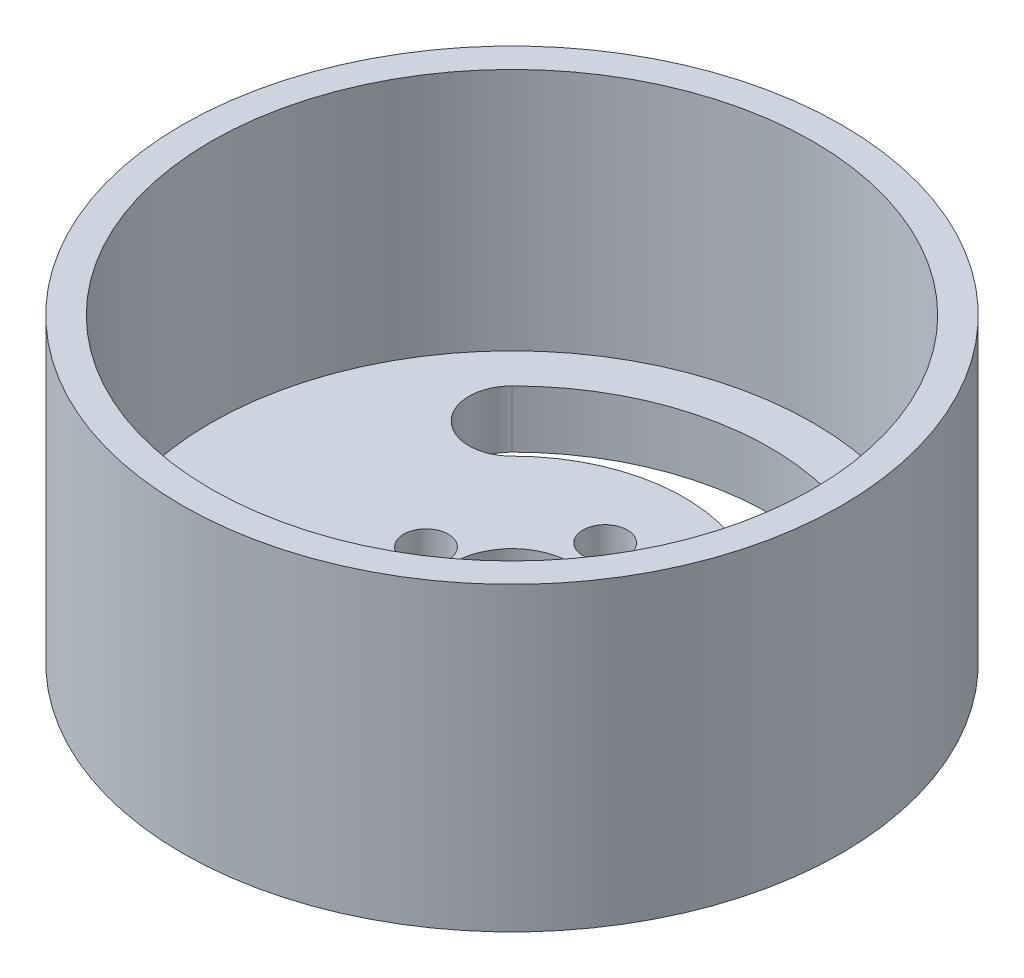
ISO-10303-21;
HEADER;
FILE_DESCRIPTION(('STEP AP214'),'2;1');
FILE_NAME('part.step','',(''),(''),'','','');
FILE_SCHEMA(('AUTOMOTIVE_DESIGN { 1 0 10303 214 1 1 1 1 }'));
ENDSEC;
DATA;
#1=APPLICATION_CONTEXT('core data for automotive mechanical design processes');
#2=APPLICATION_PROTOCOL_DEFINITION('international standard','automotive_design',2000,#1);
#3=PRODUCT_CONTEXT('',#1,'mechanical');
#4=PRODUCT('Part','Part','',(#3));
#5=PRODUCT_RELATED_PRODUCT_CATEGORY('part','',(#4));
#6=PRODUCT_DEFINITION_FORMATION('','',#4);
#7=PRODUCT_DEFINITION_CONTEXT('part definition',#1,'design');
#8=PRODUCT_DEFINITION('design','',#6,#7);
#9=PRODUCT_DEFINITION_SHAPE('','',#8);
#10=(LENGTH_UNIT() NAMED_UNIT(*) SI_UNIT(.MILLI.,.METRE.));
#11=(NAMED_UNIT(*) PLANE_ANGLE_UNIT() SI_UNIT($,.RADIAN.));
#12=(NAMED_UNIT(*) SI_UNIT($,.STERADIAN.) SOLID_ANGLE_UNIT());
#13=UNCERTAINTY_MEASURE_WITH_UNIT(LENGTH_MEASURE(1.E-05),#10,'distance_accuracy_value','');
#14=(GEOMETRIC_REPRESENTATION_CONTEXT(3) GLOBAL_UNCERTAINTY_ASSIGNED_CONTEXT((#13)) GLOBAL_UNIT_ASSIGNED_CONTEXT((#10,
#11,#12)) REPRESENTATION_CONTEXT('',''));
#15=CARTESIAN_POINT('',(0.,0.,0.));
#16=DIRECTION('',(0.,0.,1.));
#17=DIRECTION('',(1.,0.,0.));
#18=AXIS2_PLACEMENT_3D('',#15,#16,#17);
#19=CARTESIAN_POINT('',(0.,4.,0.));
#20=DIRECTION('',(0.,1.,0.));
#21=DIRECTION('',(0.,0.,1.));
#22=AXIS2_PLACEMENT_3D('',#19,#20,#21);
#23=PLANE('',#22);
#24=CARTESIAN_POINT('',(0.,4.,0.));
#25=DIRECTION('',(0.,-1.,0.));
#26=DIRECTION('',(0.,0.,-1.));
#27=AXIS2_PLACEMENT_3D('',#24,#25,#26);
#28=CIRCLE('',#27,21.);
#29=CARTESIAN_POINT('',(0.,4.,-21.));
#30=VERTEX_POINT('',#29);
#31=EDGE_CURVE('E19',#30,#30,#28,.F.);
#32=ORIENTED_EDGE('',*,*,#31,.T.);
#33=EDGE_LOOP('',(#32));
#34=FACE_BOUND('',#33,.T.);
#35=CARTESIAN_POINT('',(0.,4.,6.5));
#36=DIRECTION('',(0.,-1.,0.));
#37=DIRECTION('',(0.,0.,-1.));
#38=AXIS2_PLACEMENT_3D('',#35,#36,#37);
#39=CIRCLE('',#38,1.55);
#40=CARTESIAN_POINT('',(0.,4.,4.95));
#41=VERTEX_POINT('',#40);
#42=EDGE_CURVE('E166',#41,#41,#39,.T.);
#43=ORIENTED_EDGE('',*,*,#42,.T.);
#44=EDGE_LOOP('',(#43));
#45=FACE_BOUND('',#44,.T.);
#46=CARTESIAN_POINT('',(6.,4.,0.));
#47=DIRECTION('',(0.,-1.,0.));
#48=DIRECTION('',(0.,0.,-1.));
#49=AXIS2_PLACEMENT_3D('',#46,#47,#48);
#50=CIRCLE('',#49,1.55);
#51=CARTESIAN_POINT('',(6.,4.,-1.55));
#52=VERTEX_POINT('',#51);
#53=EDGE_CURVE('E172',#52,#52,#50,.T.);
#54=ORIENTED_EDGE('',*,*,#53,.T.);
#55=EDGE_LOOP('',(#54));
#56=FACE_BOUND('',#55,.T.);
#57=CARTESIAN_POINT('',(0.,4.,-6.5));
#58=DIRECTION('',(0.,-1.,0.));
#59=DIRECTION('',(0.,0.,-1.));
#60=AXIS2_PLACEMENT_3D('',#57,#58,#59);
#61=CIRCLE('',#60,1.55);
#62=CARTESIAN_POINT('',(0.,4.,-8.05));
#63=VERTEX_POINT('',#62);
#64=EDGE_CURVE('E97',#63,#63,#61,.T.);
#65=ORIENTED_EDGE('',*,*,#64,.T.);
#66=EDGE_LOOP('',(#65));
#67=FACE_BOUND('',#66,.T.);
#68=CARTESIAN_POINT('',(-6.,4.,0.));
#69=DIRECTION('',(0.,-1.,0.));
#70=DIRECTION('',(0.,0.,-1.));
#71=AXIS2_PLACEMENT_3D('',#68,#69,#70);
#72=CIRCLE('',#71,1.55);
#73=CARTESIAN_POINT('',(-6.,4.,-1.55));
#74=VERTEX_POINT('',#73);
#75=EDGE_CURVE('E169',#74,#74,#72,.T.);
#76=ORIENTED_EDGE('',*,*,#75,.T.);
#77=EDGE_LOOP('',(#76));
#78=FACE_BOUND('',#77,.T.);
#79=CARTESIAN_POINT('',(0.,4.,0.));
#80=DIRECTION('',(0.,-1.,0.));
#81=DIRECTION('',(0.,0.,-1.));
#82=AXIS2_PLACEMENT_3D('',#79,#80,#81);
#83=CIRCLE('',#82,4.1);
#84=CARTESIAN_POINT('',(0.,4.,-4.1));
#85=VERTEX_POINT('',#84);
#86=EDGE_CURVE('E163',#85,#85,#83,.T.);
#87=ORIENTED_EDGE('',*,*,#86,.T.);
#88=EDGE_LOOP('',(#87));
#89=FACE_BOUND('',#88,.T.);
#90=CARTESIAN_POINT('',(0.,4.,0.));
#91=DIRECTION('',(0.,-1.,0.));
#92=DIRECTION('',(0.,0.,-1.));
#93=AXIS2_PLACEMENT_3D('',#90,#91,#92);
#94=CIRCLE('',#93,18.);
#95=CARTESIAN_POINT('',(12.7279220613577,4.,12.727922061358));
#96=VERTEX_POINT('',#95);
#97=CARTESIAN_POINT('',(-12.7279220613577,4.,12.727922061358));
#98=VERTEX_POINT('',#97);
#99=EDGE_CURVE('E79',#96,#98,#94,.T.);
#100=ORIENTED_EDGE('',*,*,#99,.T.);
#101=CARTESIAN_POINT('',(-10.6066017177981,4.,10.6066017177983));
#102=DIRECTION('',(0.,-1.,0.));
#103=DIRECTION('',(0.,0.,-1.));
#104=AXIS2_PLACEMENT_3D('',#101,#102,#103);
#105=CIRCLE('',#104,3.);
#106=CARTESIAN_POINT('',(-8.48528137423846,4.,8.48528137423868));
#107=VERTEX_POINT('',#106);
#108=EDGE_CURVE('E112',#98,#107,#105,.T.);
#109=ORIENTED_EDGE('',*,*,#108,.T.);
#110=CARTESIAN_POINT('',(0.,4.,0.));
#111=DIRECTION('',(0.,-1.,0.));
#112=DIRECTION('',(0.,0.,-1.));
#113=AXIS2_PLACEMENT_3D('',#110,#111,#112);
#114=CIRCLE('',#113,12.);
#115=CARTESIAN_POINT('',(8.48528137423847,4.,8.48528137423867));
#116=VERTEX_POINT('',#115);
#117=EDGE_CURVE('E93',#116,#107,#114,.T.);
#118=ORIENTED_EDGE('',*,*,#117,.F.);
#119=CARTESIAN_POINT('',(10.6066017177981,4.,10.6066017177983));
#120=DIRECTION('',(0.,-1.,0.));
#121=DIRECTION('',(0.,0.,-1.));
#122=AXIS2_PLACEMENT_3D('',#119,#120,#121);
#123=CIRCLE('',#122,3.);
#124=EDGE_CURVE('E90',#116,#96,#123,.T.);
#125=ORIENTED_EDGE('',*,*,#124,.T.);
#126=EDGE_LOOP('',(#100,#109,#118,#125));
#127=FACE_BOUND('',#126,.T.);
#128=CARTESIAN_POINT('',(-10.6066017177981,4.,-10.6066017177983));
#129=DIRECTION('',(0.,-1.,0.));
#130=DIRECTION('',(0.,0.,-1.));
#131=AXIS2_PLACEMENT_3D('',#128,#129,#130);
#132=CIRCLE('',#131,3.);
#133=CARTESIAN_POINT('',(-8.48528137423846,4.,-8.48528137423867));
#134=VERTEX_POINT('',#133);
#135=CARTESIAN_POINT('',(-12.7279220613577,4.,-12.727922061358));
#136=VERTEX_POINT('',#135);
#137=EDGE_CURVE('E160',#134,#136,#132,.T.);
#138=ORIENTED_EDGE('',*,*,#137,.T.);
#139=CARTESIAN_POINT('',(0.,4.,0.));
#140=DIRECTION('',(0.,-1.,0.));
#141=DIRECTION('',(0.,0.,-1.));
#142=AXIS2_PLACEMENT_3D('',#139,#140,#141);
#143=CIRCLE('',#142,18.);
#144=CARTESIAN_POINT('',(12.7279220613577,4.,-12.727922061358));
#145=VERTEX_POINT('',#144);
#146=EDGE_CURVE('E158',#136,#145,#143,.T.);
#147=ORIENTED_EDGE('',*,*,#146,.T.);
#148=CARTESIAN_POINT('',(10.6066017177981,4.,-10.6066017177983));
#149=DIRECTION('',(0.,-1.,0.));
#150=DIRECTION('',(0.,0.,-1.));
#151=AXIS2_PLACEMENT_3D('',#148,#149,#150);
#152=CIRCLE('',#151,3.);
#153=CARTESIAN_POINT('',(8.48528137423846,4.,-8.48528137423867));
#154=VERTEX_POINT('',#153);
#155=EDGE_CURVE('E154',#145,#154,#152,.T.);
#156=ORIENTED_EDGE('',*,*,#155,.T.);
#157=CARTESIAN_POINT('',(0.,4.,0.));
#158=DIRECTION('',(0.,-1.,0.));
#159=DIRECTION('',(0.,0.,-1.));
#160=AXIS2_PLACEMENT_3D('',#157,#158,#159);
#161=CIRCLE('',#160,12.);
#162=EDGE_CURVE('E151',#134,#154,#161,.T.);
#163=ORIENTED_EDGE('',*,*,#162,.F.);
#164=EDGE_LOOP('',(#138,#147,#156,#163));
#165=FACE_BOUND('',#164,.T.);
#166=ADVANCED_FACE('F16',(#34,#45,#56,#67,#78,#89,#127,#165),#23,.T.);
#167=CARTESIAN_POINT('',(0.,21.,0.));
#168=DIRECTION('',(0.,-1.,0.));
#169=DIRECTION('',(0.,0.,-1.));
#170=AXIS2_PLACEMENT_3D('',#167,#168,#169);
#171=CYLINDRICAL_SURFACE('',#170,21.);
#172=CARTESIAN_POINT('',(0.,21.,0.));
#173=DIRECTION('',(0.,-1.,0.));
#174=DIRECTION('',(0.,0.,-1.));
#175=AXIS2_PLACEMENT_3D('',#172,#173,#174);
#176=CIRCLE('',#175,21.);
#177=CARTESIAN_POINT('',(0.,21.,-21.));
#178=VERTEX_POINT('',#177);
#179=EDGE_CURVE('E147',#178,#178,#176,.T.);
#180=ORIENTED_EDGE('',*,*,#179,.F.);
#181=EDGE_LOOP('',(#180));
#182=FACE_BOUND('',#181,.T.);
#183=ORIENTED_EDGE('',*,*,#31,.F.);
#184=EDGE_LOOP('',(#183));
#185=FACE_BOUND('',#184,.T.);
#186=ADVANCED_FACE('F245',(#182,#185),#171,.F.);
#187=CARTESIAN_POINT('',(0.,2.,0.));
#188=DIRECTION('',(0.,-1.,0.));
#189=DIRECTION('',(0.,0.,-1.));
#190=AXIS2_PLACEMENT_3D('',#187,#188,#189);
#191=CYLINDRICAL_SURFACE('',#190,18.);
#192=DIRECTION('',(0.,-1.,0.));
#193=VECTOR('',#192,1.);
#194=CARTESIAN_POINT('',(-12.7279220613577,2.,12.727922061358));
#195=LINE('',#194,#193);
#196=CARTESIAN_POINT('',(-12.7279220613577,0.,12.727922061358));
#197=VERTEX_POINT('',#196);
#198=EDGE_CURVE('E87',#197,#98,#195,.F.);
#199=ORIENTED_EDGE('',*,*,#198,.T.);
#200=ORIENTED_EDGE('',*,*,#99,.F.);
#201=DIRECTION('',(0.,-1.,0.));
#202=VECTOR('',#201,1.);
#203=CARTESIAN_POINT('',(12.7279220613577,2.,12.727922061358));
#204=LINE('',#203,#202);
#205=CARTESIAN_POINT('',(12.7279220613577,0.,12.727922061358));
#206=VERTEX_POINT('',#205);
#207=EDGE_CURVE('E84',#96,#206,#204,.T.);
#208=ORIENTED_EDGE('',*,*,#207,.T.);
#209=CARTESIAN_POINT('',(0.,0.,0.));
#210=DIRECTION('',(0.,-1.,0.));
#211=DIRECTION('',(0.,0.,-1.));
#212=AXIS2_PLACEMENT_3D('',#209,#210,#211);
#213=CIRCLE('',#212,18.);
#214=EDGE_CURVE('E145',#206,#197,#213,.T.);
#215=ORIENTED_EDGE('',*,*,#214,.T.);
#216=EDGE_LOOP('',(#199,#200,#208,#215));
#217=FACE_BOUND('',#216,.T.);
#218=ADVANCED_FACE('F81',(#217),#191,.F.);
#219=CARTESIAN_POINT('',(-10.6066017177981,2.,10.6066017177983));
#220=DIRECTION('',(0.,-1.,0.));
#221=DIRECTION('',(0.,0.,-1.));
#222=AXIS2_PLACEMENT_3D('',#219,#220,#221);
#223=CYLINDRICAL_SURFACE('',#222,3.);
#224=ORIENTED_EDGE('',*,*,#108,.F.);
#225=ORIENTED_EDGE('',*,*,#198,.F.);
#226=CARTESIAN_POINT('',(-10.6066017177981,0.,10.6066017177983));
#227=DIRECTION('',(0.,-1.,0.));
#228=DIRECTION('',(0.,0.,-1.));
#229=AXIS2_PLACEMENT_3D('',#226,#227,#228);
#230=CIRCLE('',#229,3.);
#231=CARTESIAN_POINT('',(-8.48528137423846,0.,8.48528137423868));
#232=VERTEX_POINT('',#231);
#233=EDGE_CURVE('E143',#197,#232,#230,.T.);
#234=ORIENTED_EDGE('',*,*,#233,.T.);
#235=DIRECTION('',(0.,-1.,0.));
#236=VECTOR('',#235,1.);
#237=CARTESIAN_POINT('',(-8.48528137423846,2.,8.48528137423868));
#238=LINE('',#237,#236);
#239=EDGE_CURVE('E104',#107,#232,#238,.T.);
#240=ORIENTED_EDGE('',*,*,#239,.F.);
#241=EDGE_LOOP('',(#224,#225,#234,#240));
#242=FACE_BOUND('',#241,.T.);
#243=ADVANCED_FACE('F181',(#242),#223,.F.);
#244=CARTESIAN_POINT('',(0.,2.,0.));
#245=DIRECTION('',(0.,-1.,0.));
#246=DIRECTION('',(0.,0.,-1.));
#247=AXIS2_PLACEMENT_3D('',#244,#245,#246);
#248=CYLINDRICAL_SURFACE('',#247,12.);
#249=ORIENTED_EDGE('',*,*,#117,.T.);
#250=ORIENTED_EDGE('',*,*,#239,.T.);
#251=CARTESIAN_POINT('',(0.,0.,0.));
#252=DIRECTION('',(0.,-1.,0.));
#253=DIRECTION('',(0.,0.,-1.));
#254=AXIS2_PLACEMENT_3D('',#251,#252,#253);
#255=CIRCLE('',#254,12.);
#256=CARTESIAN_POINT('',(8.48528137423847,0.,8.48528137423867));
#257=VERTEX_POINT('',#256);
#258=EDGE_CURVE('E140',#232,#257,#255,.F.);
#259=ORIENTED_EDGE('',*,*,#258,.T.);
#260=DIRECTION('',(0.,-1.,0.));
#261=VECTOR('',#260,1.);
#262=CARTESIAN_POINT('',(8.48528137423847,2.,8.48528137423867));
#263=LINE('',#262,#261);
#264=EDGE_CURVE('E102',#257,#116,#263,.F.);
#265=ORIENTED_EDGE('',*,*,#264,.T.);
#266=EDGE_LOOP('',(#249,#250,#259,#265));
#267=FACE_BOUND('',#266,.T.);
#268=ADVANCED_FACE('F184',(#267),#248,.T.);
#269=CARTESIAN_POINT('',(10.6066017177981,2.,10.6066017177983));
#270=DIRECTION('',(0.,-1.,0.));
#271=DIRECTION('',(0.,0.,-1.));
#272=AXIS2_PLACEMENT_3D('',#269,#270,#271);
#273=CYLINDRICAL_SURFACE('',#272,3.);
#274=ORIENTED_EDGE('',*,*,#124,.F.);
#275=ORIENTED_EDGE('',*,*,#264,.F.);
#276=CARTESIAN_POINT('',(10.6066017177981,0.,10.6066017177983));
#277=DIRECTION('',(0.,-1.,0.));
#278=DIRECTION('',(0.,0.,-1.));
#279=AXIS2_PLACEMENT_3D('',#276,#277,#278);
#280=CIRCLE('',#279,3.);
#281=EDGE_CURVE('E100',#257,#206,#280,.T.);
#282=ORIENTED_EDGE('',*,*,#281,.T.);
#283=ORIENTED_EDGE('',*,*,#207,.F.);
#284=EDGE_LOOP('',(#274,#275,#282,#283));
#285=FACE_BOUND('',#284,.T.);
#286=ADVANCED_FACE('F99',(#285),#273,.F.);
#287=CARTESIAN_POINT('',(0.,2.,-6.5));
#288=DIRECTION('',(0.,-1.,0.));
#289=DIRECTION('',(0.,0.,-1.));
#290=AXIS2_PLACEMENT_3D('',#287,#288,#289);
#291=CYLINDRICAL_SURFACE('',#290,1.55);
#292=CARTESIAN_POINT('',(0.,0.,-6.5));
#293=DIRECTION('',(0.,-1.,0.));
#294=DIRECTION('',(0.,0.,-1.));
#295=AXIS2_PLACEMENT_3D('',#292,#293,#294);
#296=CIRCLE('',#295,1.55);
#297=CARTESIAN_POINT('',(0.,0.,-8.05));
#298=VERTEX_POINT('',#297);
#299=EDGE_CURVE('E136',#298,#298,#296,.T.);
#300=ORIENTED_EDGE('',*,*,#299,.T.);
#301=EDGE_LOOP('',(#300));
#302=FACE_BOUND('',#301,.T.);
#303=ORIENTED_EDGE('',*,*,#64,.F.);
#304=EDGE_LOOP('',(#303));
#305=FACE_BOUND('',#304,.T.);
#306=ADVANCED_FACE('F233',(#302,#305),#291,.F.);
#307=CARTESIAN_POINT('',(6.,2.,0.));
#308=DIRECTION('',(0.,-1.,0.));
#309=DIRECTION('',(0.,0.,-1.));
#310=AXIS2_PLACEMENT_3D('',#307,#308,#309);
#311=CYLINDRICAL_SURFACE('',#310,1.55);
#312=CARTESIAN_POINT('',(6.,0.,0.));
#313=DIRECTION('',(0.,-1.,0.));
#314=DIRECTION('',(0.,0.,-1.));
#315=AXIS2_PLACEMENT_3D('',#312,#313,#314);
#316=CIRCLE('',#315,1.55);
#317=CARTESIAN_POINT('',(6.,0.,-1.55));
#318=VERTEX_POINT('',#317);
#319=EDGE_CURVE('E133',#318,#318,#316,.T.);
#320=ORIENTED_EDGE('',*,*,#319,.T.);
#321=EDGE_LOOP('',(#320));
#322=FACE_BOUND('',#321,.T.);
#323=ORIENTED_EDGE('',*,*,#53,.F.);
#324=EDGE_LOOP('',(#323));
#325=FACE_BOUND('',#324,.T.);
#326=ADVANCED_FACE('F229',(#322,#325),#311,.F.);
#327=CARTESIAN_POINT('',(-6.,2.,0.));
#328=DIRECTION('',(0.,-1.,0.));
#329=DIRECTION('',(0.,0.,-1.));
#330=AXIS2_PLACEMENT_3D('',#327,#328,#329);
#331=CYLINDRICAL_SURFACE('',#330,1.55);
#332=CARTESIAN_POINT('',(-6.,0.,0.));
#333=DIRECTION('',(0.,-1.,0.));
#334=DIRECTION('',(0.,0.,-1.));
#335=AXIS2_PLACEMENT_3D('',#332,#333,#334);
#336=CIRCLE('',#335,1.55);
#337=CARTESIAN_POINT('',(-6.,0.,-1.55));
#338=VERTEX_POINT('',#337);
#339=EDGE_CURVE('E130',#338,#338,#336,.T.);
#340=ORIENTED_EDGE('',*,*,#339,.T.);
#341=EDGE_LOOP('',(#340));
#342=FACE_BOUND('',#341,.T.);
#343=ORIENTED_EDGE('',*,*,#75,.F.);
#344=EDGE_LOOP('',(#343));
#345=FACE_BOUND('',#344,.T.);
#346=ADVANCED_FACE('F225',(#342,#345),#331,.F.);
#347=CARTESIAN_POINT('',(0.,2.,6.5));
#348=DIRECTION('',(0.,-1.,0.));
#349=DIRECTION('',(0.,0.,-1.));
#350=AXIS2_PLACEMENT_3D('',#347,#348,#349);
#351=CYLINDRICAL_SURFACE('',#350,1.55);
#352=CARTESIAN_POINT('',(0.,0.,6.5));
#353=DIRECTION('',(0.,-1.,0.));
#354=DIRECTION('',(0.,0.,-1.));
#355=AXIS2_PLACEMENT_3D('',#352,#353,#354);
#356=CIRCLE('',#355,1.55);
#357=CARTESIAN_POINT('',(0.,0.,4.95));
#358=VERTEX_POINT('',#357);
#359=EDGE_CURVE('E127',#358,#358,#356,.T.);
#360=ORIENTED_EDGE('',*,*,#359,.T.);
#361=EDGE_LOOP('',(#360));
#362=FACE_BOUND('',#361,.T.);
#363=ORIENTED_EDGE('',*,*,#42,.F.);
#364=EDGE_LOOP('',(#363));
#365=FACE_BOUND('',#364,.T.);
#366=ADVANCED_FACE('F221',(#362,#365),#351,.F.);
#367=CARTESIAN_POINT('',(0.,2.,0.));
#368=DIRECTION('',(0.,-1.,0.));
#369=DIRECTION('',(0.,0.,-1.));
#370=AXIS2_PLACEMENT_3D('',#367,#368,#369);
#371=CYLINDRICAL_SURFACE('',#370,4.1);
#372=CARTESIAN_POINT('',(0.,0.,0.));
#373=DIRECTION('',(0.,-1.,0.));
#374=DIRECTION('',(0.,0.,-1.));
#375=AXIS2_PLACEMENT_3D('',#372,#373,#374);
#376=CIRCLE('',#375,4.1);
#377=CARTESIAN_POINT('',(0.,0.,-4.1));
#378=VERTEX_POINT('',#377);
#379=EDGE_CURVE('E124',#378,#378,#376,.T.);
#380=ORIENTED_EDGE('',*,*,#379,.T.);
#381=EDGE_LOOP('',(#380));
#382=FACE_BOUND('',#381,.T.);
#383=ORIENTED_EDGE('',*,*,#86,.F.);
#384=EDGE_LOOP('',(#383));
#385=FACE_BOUND('',#384,.T.);
#386=ADVANCED_FACE('F217',(#382,#385),#371,.F.);
#387=CARTESIAN_POINT('',(-10.6066017177981,2.,-10.6066017177983));
#388=DIRECTION('',(0.,-1.,0.));
#389=DIRECTION('',(0.,0.,-1.));
#390=AXIS2_PLACEMENT_3D('',#387,#388,#389);
#391=CYLINDRICAL_SURFACE('',#390,3.);
#392=DIRECTION('',(0.,-1.,0.));
#393=VECTOR('',#392,1.);
#394=CARTESIAN_POINT('',(-12.7279220613577,2.,-12.727922061358));
#395=LINE('',#394,#393);
#396=CARTESIAN_POINT('',(-12.7279220613577,0.,-12.727922061358));
#397=VERTEX_POINT('',#396);
#398=EDGE_CURVE('E107',#397,#136,#395,.F.);
#399=ORIENTED_EDGE('',*,*,#398,.T.);
#400=ORIENTED_EDGE('',*,*,#137,.F.);
#401=DIRECTION('',(0.,-1.,0.));
#402=VECTOR('',#401,1.);
#403=CARTESIAN_POINT('',(-8.48528137423846,2.,-8.48528137423867));
#404=LINE('',#403,#402);
#405=CARTESIAN_POINT('',(-8.48528137423846,0.,-8.48528137423867));
#406=VERTEX_POINT('',#405);
#407=EDGE_CURVE('E150',#406,#134,#404,.F.);
#408=ORIENTED_EDGE('',*,*,#407,.F.);
#409=CARTESIAN_POINT('',(-10.6066017177981,0.,-10.6066017177983));
#410=DIRECTION('',(0.,-1.,0.));
#411=DIRECTION('',(0.,0.,-1.));
#412=AXIS2_PLACEMENT_3D('',#409,#410,#411);
#413=CIRCLE('',#412,3.);
#414=EDGE_CURVE('E121',#406,#397,#413,.T.);
#415=ORIENTED_EDGE('',*,*,#414,.T.);
#416=EDGE_LOOP('',(#399,#400,#408,#415));
#417=FACE_BOUND('',#416,.T.);
#418=ADVANCED_FACE('F213',(#417),#391,.F.);
#419=CARTESIAN_POINT('',(0.,2.,0.));
#420=DIRECTION('',(0.,-1.,0.));
#421=DIRECTION('',(0.,0.,-1.));
#422=AXIS2_PLACEMENT_3D('',#419,#420,#421);
#423=CYLINDRICAL_SURFACE('',#422,18.);
#424=ORIENTED_EDGE('',*,*,#146,.F.);
#425=ORIENTED_EDGE('',*,*,#398,.F.);
#426=CARTESIAN_POINT('',(0.,0.,0.));
#427=DIRECTION('',(0.,-1.,0.));
#428=DIRECTION('',(0.,0.,-1.));
#429=AXIS2_PLACEMENT_3D('',#426,#427,#428);
#430=CIRCLE('',#429,18.);
#431=CARTESIAN_POINT('',(12.7279220613577,0.,-12.727922061358));
#432=VERTEX_POINT('',#431);
#433=EDGE_CURVE('E119',#397,#432,#430,.T.);
#434=ORIENTED_EDGE('',*,*,#433,.T.);
#435=DIRECTION('',(0.,-1.,0.));
#436=VECTOR('',#435,1.);
#437=CARTESIAN_POINT('',(12.7279220613577,2.,-12.727922061358));
#438=LINE('',#437,#436);
#439=EDGE_CURVE('E157',#432,#145,#438,.F.);
#440=ORIENTED_EDGE('',*,*,#439,.T.);
#441=EDGE_LOOP('',(#424,#425,#434,#440));
#442=FACE_BOUND('',#441,.T.);
#443=ADVANCED_FACE('F209',(#442),#423,.F.);
#444=CARTESIAN_POINT('',(10.6066017177981,2.,-10.6066017177983));
#445=DIRECTION('',(0.,-1.,0.));
#446=DIRECTION('',(0.,0.,-1.));
#447=AXIS2_PLACEMENT_3D('',#444,#445,#446);
#448=CYLINDRICAL_SURFACE('',#447,3.);
#449=DIRECTION('',(0.,-1.,0.));
#450=VECTOR('',#449,1.);
#451=CARTESIAN_POINT('',(8.48528137423846,2.,-8.48528137423867));
#452=LINE('',#451,#450);
#453=CARTESIAN_POINT('',(8.48528137423846,0.,-8.48528137423867));
#454=VERTEX_POINT('',#453);
#455=EDGE_CURVE('E153',#154,#454,#452,.T.);
#456=ORIENTED_EDGE('',*,*,#455,.F.);
#457=ORIENTED_EDGE('',*,*,#155,.F.);
#458=ORIENTED_EDGE('',*,*,#439,.F.);
#459=CARTESIAN_POINT('',(10.6066017177981,0.,-10.6066017177983));
#460=DIRECTION('',(0.,-1.,0.));
#461=DIRECTION('',(0.,0.,-1.));
#462=AXIS2_PLACEMENT_3D('',#459,#460,#461);
#463=CIRCLE('',#462,3.);
#464=EDGE_CURVE('E117',#432,#454,#463,.T.);
#465=ORIENTED_EDGE('',*,*,#464,.T.);
#466=EDGE_LOOP('',(#456,#457,#458,#465));
#467=FACE_BOUND('',#466,.T.);
#468=ADVANCED_FACE('F205',(#467),#448,.F.);
#469=CARTESIAN_POINT('',(0.,2.,0.));
#470=DIRECTION('',(0.,-1.,0.));
#471=DIRECTION('',(0.,0.,-1.));
#472=AXIS2_PLACEMENT_3D('',#469,#470,#471);
#473=CYLINDRICAL_SURFACE('',#472,12.);
#474=CARTESIAN_POINT('',(0.,0.,0.));
#475=DIRECTION('',(0.,-1.,0.));
#476=DIRECTION('',(0.,0.,-1.));
#477=AXIS2_PLACEMENT_3D('',#474,#475,#476);
#478=CIRCLE('',#477,12.);
#479=EDGE_CURVE('E34',#454,#406,#478,.F.);
#480=ORIENTED_EDGE('',*,*,#479,.T.);
#481=ORIENTED_EDGE('',*,*,#407,.T.);
#482=ORIENTED_EDGE('',*,*,#162,.T.);
#483=ORIENTED_EDGE('',*,*,#455,.T.);
#484=EDGE_LOOP('',(#480,#481,#482,#483));
#485=FACE_BOUND('',#484,.T.);
#486=ADVANCED_FACE('F198',(#485),#473,.T.);
#487=CARTESIAN_POINT('',(0.,21.,0.));
#488=DIRECTION('',(0.,1.,0.));
#489=DIRECTION('',(0.,0.,1.));
#490=AXIS2_PLACEMENT_3D('',#487,#488,#489);
#491=PLANE('',#490);
#492=ORIENTED_EDGE('',*,*,#179,.T.);
#493=EDGE_LOOP('',(#492));
#494=FACE_BOUND('',#493,.T.);
#495=CARTESIAN_POINT('',(0.,21.,0.));
#496=DIRECTION('',(0.,-1.,0.));
#497=DIRECTION('',(0.,0.,-1.));
#498=AXIS2_PLACEMENT_3D('',#495,#496,#497);
#499=CIRCLE('',#498,23.);
#500=CARTESIAN_POINT('',(0.,21.,-23.));
#501=VERTEX_POINT('',#500);
#502=EDGE_CURVE('E25',#501,#501,#499,.T.);
#503=ORIENTED_EDGE('',*,*,#502,.F.);
#504=EDGE_LOOP('',(#503));
#505=FACE_BOUND('',#504,.T.);
#506=ADVANCED_FACE('F189',(#494,#505),#491,.T.);
#507=CARTESIAN_POINT('',(0.,0.,0.));
#508=DIRECTION('',(0.,1.,0.));
#509=DIRECTION('',(0.,0.,1.));
#510=AXIS2_PLACEMENT_3D('',#507,#508,#509);
#511=PLANE('',#510);
#512=ORIENTED_EDGE('',*,*,#479,.F.);
#513=ORIENTED_EDGE('',*,*,#464,.F.);
#514=ORIENTED_EDGE('',*,*,#433,.F.);
#515=ORIENTED_EDGE('',*,*,#414,.F.);
#516=EDGE_LOOP('',(#512,#513,#514,#515));
#517=FACE_BOUND('',#516,.T.);
#518=ORIENTED_EDGE('',*,*,#379,.F.);
#519=EDGE_LOOP('',(#518));
#520=FACE_BOUND('',#519,.T.);
#521=ORIENTED_EDGE('',*,*,#359,.F.);
#522=EDGE_LOOP('',(#521));
#523=FACE_BOUND('',#522,.T.);
#524=ORIENTED_EDGE('',*,*,#339,.F.);
#525=EDGE_LOOP('',(#524));
#526=FACE_BOUND('',#525,.T.);
#527=ORIENTED_EDGE('',*,*,#319,.F.);
#528=EDGE_LOOP('',(#527));
#529=FACE_BOUND('',#528,.T.);
#530=ORIENTED_EDGE('',*,*,#299,.F.);
#531=EDGE_LOOP('',(#530));
#532=FACE_BOUND('',#531,.T.);
#533=CARTESIAN_POINT('',(0.,0.,0.));
#534=DIRECTION('',(0.,-1.,0.));
#535=DIRECTION('',(0.,0.,-1.));
#536=AXIS2_PLACEMENT_3D('',#533,#534,#535);
#537=CIRCLE('',#536,23.);
#538=CARTESIAN_POINT('',(0.,0.,-23.));
#539=VERTEX_POINT('',#538);
#540=EDGE_CURVE('E11',#539,#539,#537,.F.);
#541=ORIENTED_EDGE('',*,*,#540,.F.);
#542=EDGE_LOOP('',(#541));
#543=FACE_BOUND('',#542,.T.);
#544=ORIENTED_EDGE('',*,*,#281,.F.);
#545=ORIENTED_EDGE('',*,*,#258,.F.);
#546=ORIENTED_EDGE('',*,*,#233,.F.);
#547=ORIENTED_EDGE('',*,*,#214,.F.);
#548=EDGE_LOOP('',(#544,#545,#546,#547));
#549=FACE_BOUND('',#548,.T.);
#550=ADVANCED_FACE('F186',(#517,#520,#523,#526,#529,#532,#543,#549),#511,.F.);
#551=CARTESIAN_POINT('',(0.,2.,0.));
#552=DIRECTION('',(0.,-1.,0.));
#553=DIRECTION('',(0.,0.,-1.));
#554=AXIS2_PLACEMENT_3D('',#551,#552,#553);
#555=CYLINDRICAL_SURFACE('',#554,23.);
#556=ORIENTED_EDGE('',*,*,#540,.T.);
#557=EDGE_LOOP('',(#556));
#558=FACE_BOUND('',#557,.T.);
#559=ORIENTED_EDGE('',*,*,#502,.T.);
#560=EDGE_LOOP('',(#559));
#561=FACE_BOUND('',#560,.T.);
#562=ADVANCED_FACE('F188',(#558,#561),#555,.T.);
#563=CLOSED_SHELL('',(#166,#186,#218,#243,#268,#286,#306,#326,#346,#366,#386,#418,#443,#468,
#486,#506,#550,#562));
#564=MANIFOLD_SOLID_BREP('B1',#563);
#565=ADVANCED_BREP_SHAPE_REPRESENTATION('',(#18,#564),#14);
#566=SHAPE_DEFINITION_REPRESENTATION(#9,#565);
ENDSEC;
END-ISO-10303-21;
